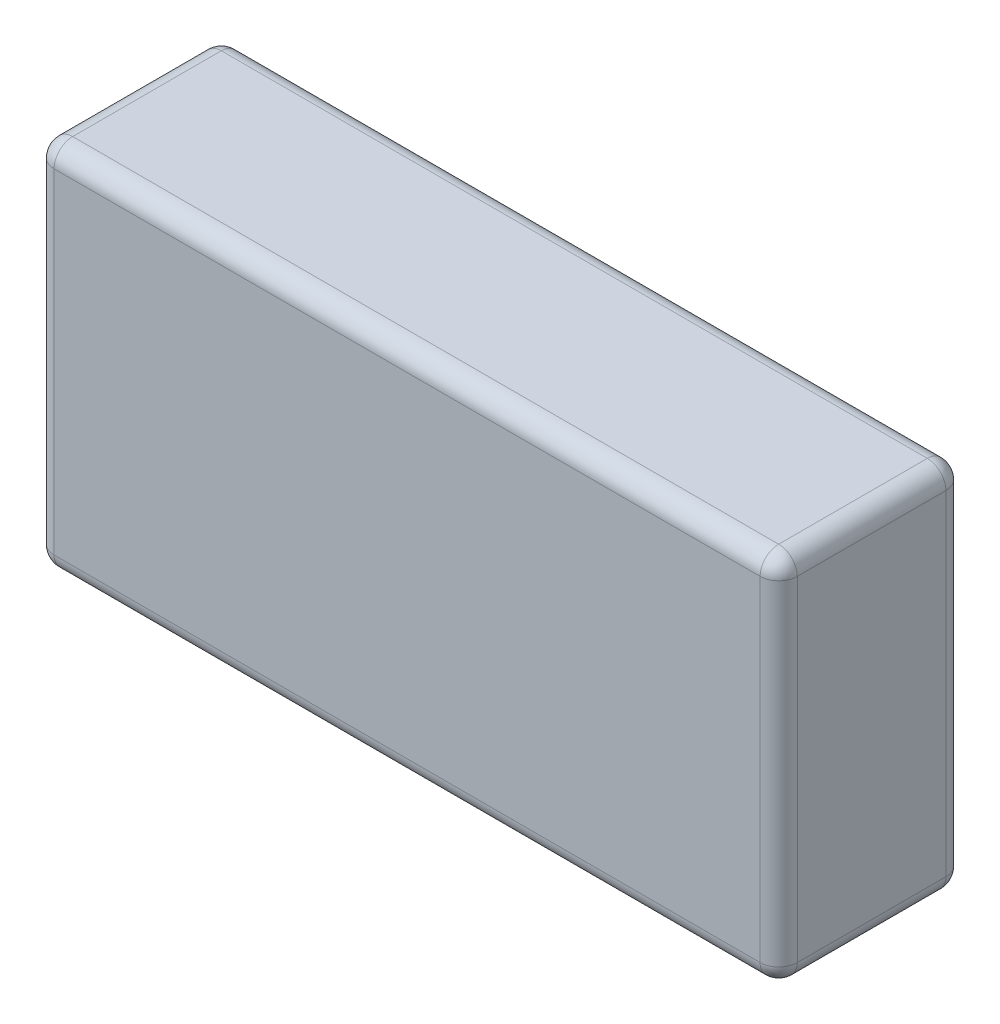
ISO-10303-21;
HEADER;
FILE_DESCRIPTION(('STEP AP214'),'2;1');
FILE_NAME('part.step','',(''),(''),'','','');
FILE_SCHEMA(('AUTOMOTIVE_DESIGN { 1 0 10303 214 1 1 1 1 }'));
ENDSEC;
DATA;
#1=APPLICATION_CONTEXT('core data for automotive mechanical design processes');
#2=APPLICATION_PROTOCOL_DEFINITION('international standard','automotive_design',2000,#1);
#3=PRODUCT_CONTEXT('',#1,'mechanical');
#4=PRODUCT('Part','Part','',(#3));
#5=PRODUCT_RELATED_PRODUCT_CATEGORY('part','',(#4));
#6=PRODUCT_DEFINITION_FORMATION('','',#4);
#7=PRODUCT_DEFINITION_CONTEXT('part definition',#1,'design');
#8=PRODUCT_DEFINITION('design','',#6,#7);
#9=PRODUCT_DEFINITION_SHAPE('','',#8);
#10=(LENGTH_UNIT() NAMED_UNIT(*) SI_UNIT(.MILLI.,.METRE.));
#11=(NAMED_UNIT(*) PLANE_ANGLE_UNIT() SI_UNIT($,.RADIAN.));
#12=(NAMED_UNIT(*) SI_UNIT($,.STERADIAN.) SOLID_ANGLE_UNIT());
#13=UNCERTAINTY_MEASURE_WITH_UNIT(LENGTH_MEASURE(1.E-05),#10,'distance_accuracy_value','');
#14=(GEOMETRIC_REPRESENTATION_CONTEXT(3) GLOBAL_UNCERTAINTY_ASSIGNED_CONTEXT((#13)) GLOBAL_UNIT_ASSIGNED_CONTEXT((#10,
#11,#12)) REPRESENTATION_CONTEXT('',''));
#15=CARTESIAN_POINT('',(0.,0.,0.));
#16=DIRECTION('',(0.,0.,1.));
#17=DIRECTION('',(1.,0.,0.));
#18=AXIS2_PLACEMENT_3D('',#15,#16,#17);
#19=CARTESIAN_POINT('',(-54.0520418666152,100.,-23.4294738015234));
#20=DIRECTION('',(1.,0.,0.));
#21=DIRECTION('',(0.,0.,-1.));
#22=AXIS2_PLACEMENT_3D('',#19,#20,#21);
#23=PLANE('',#22);
#24=DIRECTION('',(0.,0.,1.));
#25=VECTOR('',#24,1.);
#26=CARTESIAN_POINT('',(-54.0520418666152,5.,-23.4294738015234));
#27=LINE('',#26,#25);
#28=CARTESIAN_POINT('',(-54.0520418666152,5.,-18.4294738015234));
#29=VERTEX_POINT('',#28);
#30=CARTESIAN_POINT('',(-54.0520418666152,5.,21.5705261984766));
#31=VERTEX_POINT('',#30);
#32=EDGE_CURVE('E180',#29,#31,#27,.T.);
#33=ORIENTED_EDGE('',*,*,#32,.T.);
#34=DIRECTION('',(0.,-1.,0.));
#35=VECTOR('',#34,1.);
#36=CARTESIAN_POINT('',(-54.0520418666152,100.,21.5705261984766));
#37=LINE('',#36,#35);
#38=CARTESIAN_POINT('',(-54.0520418666152,95.,21.5705261984766));
#39=VERTEX_POINT('',#38);
#40=EDGE_CURVE('E187',#31,#39,#37,.F.);
#41=ORIENTED_EDGE('',*,*,#40,.T.);
#42=DIRECTION('',(0.,0.,1.));
#43=VECTOR('',#42,1.);
#44=CARTESIAN_POINT('',(-54.0520418666152,95.,-23.4294738015234));
#45=LINE('',#44,#43);
#46=CARTESIAN_POINT('',(-54.0520418666152,95.,-18.4294738015234));
#47=VERTEX_POINT('',#46);
#48=EDGE_CURVE('E183',#39,#47,#45,.F.);
#49=ORIENTED_EDGE('',*,*,#48,.T.);
#50=DIRECTION('',(0.,-1.,0.));
#51=VECTOR('',#50,1.);
#52=CARTESIAN_POINT('',(-54.0520418666152,100.,-18.4294738015234));
#53=LINE('',#52,#51);
#54=EDGE_CURVE('E177',#47,#29,#53,.T.);
#55=ORIENTED_EDGE('',*,*,#54,.T.);
#56=EDGE_LOOP('',(#33,#41,#49,#55));
#57=FACE_BOUND('',#56,.T.);
#58=ADVANCED_FACE('F39',(#57),#23,.F.);
#59=CARTESIAN_POINT('',(-54.0520418666152,100.,26.5705261984766));
#60=DIRECTION('',(0.,0.,-1.));
#61=DIRECTION('',(-1.,0.,0.));
#62=AXIS2_PLACEMENT_3D('',#59,#60,#61);
#63=PLANE('',#62);
#64=DIRECTION('',(1.,0.,0.));
#65=VECTOR('',#64,1.);
#66=CARTESIAN_POINT('',(-54.0520418666152,95.,26.5705261984766));
#67=LINE('',#66,#65);
#68=CARTESIAN_POINT('',(140.947958133385,95.,26.5705261984766));
#69=VERTEX_POINT('',#68);
#70=CARTESIAN_POINT('',(-49.0520418666152,95.,26.5705261984766));
#71=VERTEX_POINT('',#70);
#72=EDGE_CURVE('E209',#69,#71,#67,.F.);
#73=ORIENTED_EDGE('',*,*,#72,.T.);
#74=DIRECTION('',(0.,-1.,0.));
#75=VECTOR('',#74,1.);
#76=CARTESIAN_POINT('',(-49.0520418666152,100.,26.5705261984766));
#77=LINE('',#76,#75);
#78=CARTESIAN_POINT('',(-49.0520418666152,5.,26.5705261984766));
#79=VERTEX_POINT('',#78);
#80=EDGE_CURVE('E212',#71,#79,#77,.T.);
#81=ORIENTED_EDGE('',*,*,#80,.T.);
#82=DIRECTION('',(1.,0.,0.));
#83=VECTOR('',#82,1.);
#84=CARTESIAN_POINT('',(-54.0520418666152,5.,26.5705261984766));
#85=LINE('',#84,#83);
#86=CARTESIAN_POINT('',(140.947958133385,5.,26.5705261984766));
#87=VERTEX_POINT('',#86);
#88=EDGE_CURVE('E206',#79,#87,#85,.T.);
#89=ORIENTED_EDGE('',*,*,#88,.T.);
#90=DIRECTION('',(0.,-1.,0.));
#91=VECTOR('',#90,1.);
#92=CARTESIAN_POINT('',(140.947958133385,100.,26.5705261984766));
#93=LINE('',#92,#91);
#94=EDGE_CURVE('E203',#87,#69,#93,.F.);
#95=ORIENTED_EDGE('',*,*,#94,.T.);
#96=EDGE_LOOP('',(#73,#81,#89,#95));
#97=FACE_BOUND('',#96,.T.);
#98=ADVANCED_FACE('F330',(#97),#63,.F.);
#99=CARTESIAN_POINT('',(145.947958133385,100.,-23.4294738015234));
#100=DIRECTION('',(-1.,0.,0.));
#101=DIRECTION('',(0.,0.,1.));
#102=AXIS2_PLACEMENT_3D('',#99,#100,#101);
#103=PLANE('',#102);
#104=DIRECTION('',(0.,0.,-1.));
#105=VECTOR('',#104,1.);
#106=CARTESIAN_POINT('',(145.947958133385,95.,26.5705261984766));
#107=LINE('',#106,#105);
#108=CARTESIAN_POINT('',(145.947958133385,95.,-18.4294738015234));
#109=VERTEX_POINT('',#108);
#110=CARTESIAN_POINT('',(145.947958133385,95.,21.5705261984766));
#111=VERTEX_POINT('',#110);
#112=EDGE_CURVE('E146',#109,#111,#107,.F.);
#113=ORIENTED_EDGE('',*,*,#112,.T.);
#114=DIRECTION('',(0.,-1.,0.));
#115=VECTOR('',#114,1.);
#116=CARTESIAN_POINT('',(145.947958133385,100.,21.5705261984766));
#117=LINE('',#116,#115);
#118=CARTESIAN_POINT('',(145.947958133385,5.,21.5705261984766));
#119=VERTEX_POINT('',#118);
#120=EDGE_CURVE('E224',#111,#119,#117,.T.);
#121=ORIENTED_EDGE('',*,*,#120,.T.);
#122=DIRECTION('',(0.,0.,-1.));
#123=VECTOR('',#122,1.);
#124=CARTESIAN_POINT('',(145.947958133385,5.,-23.4294738015234));
#125=LINE('',#124,#123);
#126=CARTESIAN_POINT('',(145.947958133385,5.,-18.4294738015234));
#127=VERTEX_POINT('',#126);
#128=EDGE_CURVE('E219',#119,#127,#125,.T.);
#129=ORIENTED_EDGE('',*,*,#128,.T.);
#130=DIRECTION('',(0.,-1.,0.));
#131=VECTOR('',#130,1.);
#132=CARTESIAN_POINT('',(145.947958133385,100.,-18.4294738015234));
#133=LINE('',#132,#131);
#134=EDGE_CURVE('E216',#127,#109,#133,.F.);
#135=ORIENTED_EDGE('',*,*,#134,.T.);
#136=EDGE_LOOP('',(#113,#121,#129,#135));
#137=FACE_BOUND('',#136,.T.);
#138=ADVANCED_FACE('F317',(#137),#103,.F.);
#139=CARTESIAN_POINT('',(-54.0520418666152,100.,-23.4294738015234));
#140=DIRECTION('',(0.,0.,1.));
#141=DIRECTION('',(1.,0.,0.));
#142=AXIS2_PLACEMENT_3D('',#139,#140,#141);
#143=PLANE('',#142);
#144=DIRECTION('',(-1.,0.,0.));
#145=VECTOR('',#144,1.);
#146=CARTESIAN_POINT('',(145.947958133385,95.,-23.4294738015234));
#147=LINE('',#146,#145);
#148=CARTESIAN_POINT('',(-49.0520418666152,95.,-23.4294738015234));
#149=VERTEX_POINT('',#148);
#150=CARTESIAN_POINT('',(140.947958133385,95.,-23.4294738015234));
#151=VERTEX_POINT('',#150);
#152=EDGE_CURVE('E49',#149,#151,#147,.F.);
#153=ORIENTED_EDGE('',*,*,#152,.T.);
#154=DIRECTION('',(0.,-1.,0.));
#155=VECTOR('',#154,1.);
#156=CARTESIAN_POINT('',(140.947958133385,100.,-23.4294738015234));
#157=LINE('',#156,#155);
#158=CARTESIAN_POINT('',(140.947958133385,5.,-23.4294738015234));
#159=VERTEX_POINT('',#158);
#160=EDGE_CURVE('E11',#151,#159,#157,.T.);
#161=ORIENTED_EDGE('',*,*,#160,.T.);
#162=DIRECTION('',(-1.,0.,0.));
#163=VECTOR('',#162,1.);
#164=CARTESIAN_POINT('',(-54.0520418666152,5.,-23.4294738015234));
#165=LINE('',#164,#163);
#166=CARTESIAN_POINT('',(-49.0520418666152,5.,-23.4294738015234));
#167=VERTEX_POINT('',#166);
#168=EDGE_CURVE('E228',#159,#167,#165,.T.);
#169=ORIENTED_EDGE('',*,*,#168,.T.);
#170=DIRECTION('',(0.,-1.,0.));
#171=VECTOR('',#170,1.);
#172=CARTESIAN_POINT('',(-49.0520418666152,100.,-23.4294738015234));
#173=LINE('',#172,#171);
#174=EDGE_CURVE('E60',#167,#149,#173,.F.);
#175=ORIENTED_EDGE('',*,*,#174,.T.);
#176=EDGE_LOOP('',(#153,#161,#169,#175));
#177=FACE_BOUND('',#176,.T.);
#178=ADVANCED_FACE('F363',(#177),#143,.F.);
#179=CARTESIAN_POINT('',(0.,100.,0.));
#180=DIRECTION('',(0.,1.,0.));
#181=DIRECTION('',(0.,0.,1.));
#182=AXIS2_PLACEMENT_3D('',#179,#180,#181);
#183=PLANE('',#182);
#184=DIRECTION('',(-1.,0.,0.));
#185=VECTOR('',#184,1.);
#186=CARTESIAN_POINT('',(-54.0520418666152,100.,-18.4294738015234));
#187=LINE('',#186,#185);
#188=CARTESIAN_POINT('',(140.947958133385,100.,-18.4294738015234));
#189=VERTEX_POINT('',#188);
#190=CARTESIAN_POINT('',(-49.0520418666152,100.,-18.4294738015234));
#191=VERTEX_POINT('',#190);
#192=EDGE_CURVE('E132',#189,#191,#187,.T.);
#193=ORIENTED_EDGE('',*,*,#192,.T.);
#194=DIRECTION('',(0.,0.,1.));
#195=VECTOR('',#194,1.);
#196=CARTESIAN_POINT('',(-49.0520418666152,100.,26.5705261984766));
#197=LINE('',#196,#195);
#198=CARTESIAN_POINT('',(-49.0520418666152,100.,21.5705261984766));
#199=VERTEX_POINT('',#198);
#200=EDGE_CURVE('E174',#191,#199,#197,.T.);
#201=ORIENTED_EDGE('',*,*,#200,.T.);
#202=DIRECTION('',(1.,0.,0.));
#203=VECTOR('',#202,1.);
#204=CARTESIAN_POINT('',(145.947958133385,100.,21.5705261984766));
#205=LINE('',#204,#203);
#206=CARTESIAN_POINT('',(140.947958133385,100.,21.5705261984766));
#207=VERTEX_POINT('',#206);
#208=EDGE_CURVE('E135',#199,#207,#205,.T.);
#209=ORIENTED_EDGE('',*,*,#208,.T.);
#210=DIRECTION('',(0.,0.,-1.));
#211=VECTOR('',#210,1.);
#212=CARTESIAN_POINT('',(140.947958133385,100.,-23.4294738015234));
#213=LINE('',#212,#211);
#214=EDGE_CURVE('E127',#207,#189,#213,.T.);
#215=ORIENTED_EDGE('',*,*,#214,.T.);
#216=EDGE_LOOP('',(#193,#201,#209,#215));
#217=FACE_BOUND('',#216,.T.);
#218=ADVANCED_FACE('F129',(#217),#183,.T.);
#219=CARTESIAN_POINT('',(0.,0.,0.));
#220=DIRECTION('',(0.,1.,0.));
#221=DIRECTION('',(0.,0.,1.));
#222=AXIS2_PLACEMENT_3D('',#219,#220,#221);
#223=PLANE('',#222);
#224=DIRECTION('',(1.,0.,0.));
#225=VECTOR('',#224,1.);
#226=CARTESIAN_POINT('',(0.,0.,21.5705261984766));
#227=LINE('',#226,#225);
#228=CARTESIAN_POINT('',(140.947958133385,0.,21.5705261984766));
#229=VERTEX_POINT('',#228);
#230=CARTESIAN_POINT('',(-49.0520418666152,0.,21.5705261984766));
#231=VERTEX_POINT('',#230);
#232=EDGE_CURVE('E196',#229,#231,#227,.F.);
#233=ORIENTED_EDGE('',*,*,#232,.T.);
#234=DIRECTION('',(0.,0.,1.));
#235=VECTOR('',#234,1.);
#236=CARTESIAN_POINT('',(-49.0520418666152,0.,0.));
#237=LINE('',#236,#235);
#238=CARTESIAN_POINT('',(-49.0520418666152,0.,-18.4294738015234));
#239=VERTEX_POINT('',#238);
#240=EDGE_CURVE('E199',#231,#239,#237,.F.);
#241=ORIENTED_EDGE('',*,*,#240,.T.);
#242=DIRECTION('',(-1.,0.,0.));
#243=VECTOR('',#242,1.);
#244=CARTESIAN_POINT('',(0.,0.,-18.4294738015234));
#245=LINE('',#244,#243);
#246=CARTESIAN_POINT('',(140.947958133385,0.,-18.4294738015234));
#247=VERTEX_POINT('',#246);
#248=EDGE_CURVE('E190',#239,#247,#245,.F.);
#249=ORIENTED_EDGE('',*,*,#248,.T.);
#250=DIRECTION('',(0.,0.,-1.));
#251=VECTOR('',#250,1.);
#252=CARTESIAN_POINT('',(140.947958133385,0.,0.));
#253=LINE('',#252,#251);
#254=EDGE_CURVE('E193',#247,#229,#253,.F.);
#255=ORIENTED_EDGE('',*,*,#254,.T.);
#256=EDGE_LOOP('',(#233,#241,#249,#255));
#257=FACE_BOUND('',#256,.T.);
#258=ADVANCED_FACE('F346',(#257),#223,.F.);
#259=CARTESIAN_POINT('',(140.947958133385,5.,-23.4294738015234));
#260=DIRECTION('',(0.,0.,-1.));
#261=DIRECTION('',(-1.,0.,0.));
#262=AXIS2_PLACEMENT_3D('',#259,#260,#261);
#263=CYLINDRICAL_SURFACE('',#262,5.);
#264=CARTESIAN_POINT('',(140.947958133385,5.,-18.4294738015234));
#265=DIRECTION('',(0.,0.,-1.));
#266=DIRECTION('',(-1.,0.,0.));
#267=AXIS2_PLACEMENT_3D('',#264,#265,#266);
#268=CIRCLE('',#267,5.);
#269=EDGE_CURVE('E43',#127,#247,#268,.T.);
#270=ORIENTED_EDGE('',*,*,#269,.F.);
#271=ORIENTED_EDGE('',*,*,#128,.F.);
#272=CARTESIAN_POINT('',(140.947958133385,5.,21.5705261984766));
#273=DIRECTION('',(0.,0.,1.));
#274=DIRECTION('',(1.,0.,0.));
#275=AXIS2_PLACEMENT_3D('',#272,#273,#274);
#276=CIRCLE('',#275,5.);
#277=EDGE_CURVE('E170',#229,#119,#276,.T.);
#278=ORIENTED_EDGE('',*,*,#277,.F.);
#279=ORIENTED_EDGE('',*,*,#254,.F.);
#280=EDGE_LOOP('',(#270,#271,#278,#279));
#281=FACE_BOUND('',#280,.T.);
#282=ADVANCED_FACE('F41',(#281),#263,.T.);
#283=CARTESIAN_POINT('',(140.947958133385,5.,-18.4294738015234));
#284=DIRECTION('',(0.,0.,1.));
#285=DIRECTION('',(1.,0.,0.));
#286=AXIS2_PLACEMENT_3D('',#283,#284,#285);
#287=SPHERICAL_SURFACE('',#286,5.);
#288=CARTESIAN_POINT('',(140.947958133385,5.,-18.4294738015234));
#289=DIRECTION('',(0.,-1.,0.));
#290=DIRECTION('',(0.,0.,-1.));
#291=AXIS2_PLACEMENT_3D('',#288,#289,#290);
#292=CIRCLE('',#291,5.);
#293=EDGE_CURVE('E294',#127,#159,#292,.F.);
#294=ORIENTED_EDGE('',*,*,#293,.F.);
#295=ORIENTED_EDGE('',*,*,#269,.T.);
#296=CARTESIAN_POINT('',(140.947958133385,5.,-18.4294738015234));
#297=DIRECTION('',(1.,0.,0.));
#298=DIRECTION('',(0.,0.,-1.));
#299=AXIS2_PLACEMENT_3D('',#296,#297,#298);
#300=CIRCLE('',#299,5.);
#301=EDGE_CURVE('E298',#159,#247,#300,.F.);
#302=ORIENTED_EDGE('',*,*,#301,.F.);
#303=EDGE_LOOP('',(#294,#295,#302));
#304=FACE_BOUND('',#303,.T.);
#305=ADVANCED_FACE('F359',(#304),#287,.T.);
#306=CARTESIAN_POINT('',(140.947958133385,5.,21.5705261984766));
#307=DIRECTION('',(0.,0.,1.));
#308=DIRECTION('',(1.,0.,0.));
#309=AXIS2_PLACEMENT_3D('',#306,#307,#308);
#310=SPHERICAL_SURFACE('',#309,5.);
#311=CARTESIAN_POINT('',(140.947958133385,5.,21.5705261984766));
#312=DIRECTION('',(1.,0.,0.));
#313=DIRECTION('',(0.,0.,-1.));
#314=AXIS2_PLACEMENT_3D('',#311,#312,#313);
#315=CIRCLE('',#314,5.);
#316=EDGE_CURVE('E287',#229,#87,#315,.F.);
#317=ORIENTED_EDGE('',*,*,#316,.F.);
#318=ORIENTED_EDGE('',*,*,#277,.T.);
#319=CARTESIAN_POINT('',(140.947958133385,5.,21.5705261984766));
#320=DIRECTION('',(0.,-1.,0.));
#321=DIRECTION('',(0.,0.,-1.));
#322=AXIS2_PLACEMENT_3D('',#319,#320,#321);
#323=CIRCLE('',#322,5.);
#324=EDGE_CURVE('E291',#87,#119,#323,.F.);
#325=ORIENTED_EDGE('',*,*,#324,.F.);
#326=EDGE_LOOP('',(#317,#318,#325));
#327=FACE_BOUND('',#326,.T.);
#328=ADVANCED_FACE('F308',(#327),#310,.T.);
#329=CARTESIAN_POINT('',(-54.0520418666152,5.,-18.4294738015234));
#330=DIRECTION('',(-1.,0.,0.));
#331=DIRECTION('',(0.,0.,1.));
#332=AXIS2_PLACEMENT_3D('',#329,#330,#331);
#333=CYLINDRICAL_SURFACE('',#332,5.);
#334=ORIENTED_EDGE('',*,*,#301,.T.);
#335=ORIENTED_EDGE('',*,*,#248,.F.);
#336=CARTESIAN_POINT('',(-49.0520418666152,5.,-18.4294738015234));
#337=DIRECTION('',(-1.,0.,0.));
#338=DIRECTION('',(0.,0.,1.));
#339=AXIS2_PLACEMENT_3D('',#336,#337,#338);
#340=CIRCLE('',#339,5.);
#341=EDGE_CURVE('E280',#167,#239,#340,.T.);
#342=ORIENTED_EDGE('',*,*,#341,.F.);
#343=ORIENTED_EDGE('',*,*,#168,.F.);
#344=EDGE_LOOP('',(#334,#335,#342,#343));
#345=FACE_BOUND('',#344,.T.);
#346=ADVANCED_FACE('F356',(#345),#333,.T.);
#347=CARTESIAN_POINT('',(140.947958133385,100.,-18.4294738015234));
#348=DIRECTION('',(0.,-1.,0.));
#349=DIRECTION('',(0.,0.,-1.));
#350=AXIS2_PLACEMENT_3D('',#347,#348,#349);
#351=CYLINDRICAL_SURFACE('',#350,5.);
#352=ORIENTED_EDGE('',*,*,#293,.T.);
#353=ORIENTED_EDGE('',*,*,#160,.F.);
#354=CARTESIAN_POINT('',(140.947958133385,95.,-18.4294738015234));
#355=DIRECTION('',(0.,1.,0.));
#356=DIRECTION('',(0.,0.,1.));
#357=AXIS2_PLACEMENT_3D('',#354,#355,#356);
#358=CIRCLE('',#357,5.);
#359=EDGE_CURVE('E151',#109,#151,#358,.T.);
#360=ORIENTED_EDGE('',*,*,#359,.F.);
#361=ORIENTED_EDGE('',*,*,#134,.F.);
#362=EDGE_LOOP('',(#352,#353,#360,#361));
#363=FACE_BOUND('',#362,.T.);
#364=ADVANCED_FACE('F362',(#363),#351,.T.);
#365=CARTESIAN_POINT('',(140.947958133385,95.,0.));
#366=DIRECTION('',(0.,0.,1.));
#367=DIRECTION('',(1.,0.,0.));
#368=AXIS2_PLACEMENT_3D('',#365,#366,#367);
#369=CYLINDRICAL_SURFACE('',#368,5.);
#370=CARTESIAN_POINT('',(140.947958133385,95.,21.5705261984766));
#371=DIRECTION('',(0.,0.,1.));
#372=DIRECTION('',(0.,-1.,0.));
#373=AXIS2_PLACEMENT_3D('',#370,#371,#372);
#374=CIRCLE('',#373,5.);
#375=EDGE_CURVE('E152',#111,#207,#374,.T.);
#376=ORIENTED_EDGE('',*,*,#375,.F.);
#377=ORIENTED_EDGE('',*,*,#112,.F.);
#378=CARTESIAN_POINT('',(140.947958133385,95.,-18.4294738015234));
#379=DIRECTION('',(0.,0.,-1.));
#380=DIRECTION('',(-1.,0.,0.));
#381=AXIS2_PLACEMENT_3D('',#378,#379,#380);
#382=CIRCLE('',#381,5.);
#383=EDGE_CURVE('E143',#189,#109,#382,.T.);
#384=ORIENTED_EDGE('',*,*,#383,.F.);
#385=ORIENTED_EDGE('',*,*,#214,.F.);
#386=EDGE_LOOP('',(#376,#377,#384,#385));
#387=FACE_BOUND('',#386,.T.);
#388=ADVANCED_FACE('F145',(#387),#369,.T.);
#389=CARTESIAN_POINT('',(140.947958133385,100.,21.5705261984766));
#390=DIRECTION('',(0.,-1.,0.));
#391=DIRECTION('',(0.,0.,-1.));
#392=AXIS2_PLACEMENT_3D('',#389,#390,#391);
#393=CYLINDRICAL_SURFACE('',#392,5.);
#394=ORIENTED_EDGE('',*,*,#324,.T.);
#395=ORIENTED_EDGE('',*,*,#120,.F.);
#396=CARTESIAN_POINT('',(140.947958133385,95.,21.5705261984766));
#397=DIRECTION('',(0.,1.,0.));
#398=DIRECTION('',(0.,0.,1.));
#399=AXIS2_PLACEMENT_3D('',#396,#397,#398);
#400=CIRCLE('',#399,5.);
#401=EDGE_CURVE('E272',#69,#111,#400,.T.);
#402=ORIENTED_EDGE('',*,*,#401,.F.);
#403=ORIENTED_EDGE('',*,*,#94,.F.);
#404=EDGE_LOOP('',(#394,#395,#402,#403));
#405=FACE_BOUND('',#404,.T.);
#406=ADVANCED_FACE('F320',(#405),#393,.T.);
#407=CARTESIAN_POINT('',(-54.0520418666152,5.,21.5705261984766));
#408=DIRECTION('',(1.,0.,0.));
#409=DIRECTION('',(0.,0.,-1.));
#410=AXIS2_PLACEMENT_3D('',#407,#408,#409);
#411=CYLINDRICAL_SURFACE('',#410,5.);
#412=ORIENTED_EDGE('',*,*,#316,.T.);
#413=ORIENTED_EDGE('',*,*,#88,.F.);
#414=CARTESIAN_POINT('',(-49.0520418666152,5.,21.5705261984766));
#415=DIRECTION('',(-1.,0.,0.));
#416=DIRECTION('',(0.,0.,1.));
#417=AXIS2_PLACEMENT_3D('',#414,#415,#416);
#418=CIRCLE('',#417,5.);
#419=EDGE_CURVE('E268',#231,#79,#418,.T.);
#420=ORIENTED_EDGE('',*,*,#419,.F.);
#421=ORIENTED_EDGE('',*,*,#232,.F.);
#422=EDGE_LOOP('',(#412,#413,#420,#421));
#423=FACE_BOUND('',#422,.T.);
#424=ADVANCED_FACE('F343',(#423),#411,.T.);
#425=CARTESIAN_POINT('',(-49.0520418666152,5.,-23.4294738015234));
#426=DIRECTION('',(0.,0.,1.));
#427=DIRECTION('',(1.,0.,0.));
#428=AXIS2_PLACEMENT_3D('',#425,#426,#427);
#429=CYLINDRICAL_SURFACE('',#428,5.);
#430=CARTESIAN_POINT('',(-49.0520418666152,5.,-18.4294738015234));
#431=DIRECTION('',(0.,0.,-1.));
#432=DIRECTION('',(-1.,0.,0.));
#433=AXIS2_PLACEMENT_3D('',#430,#431,#432);
#434=CIRCLE('',#433,5.);
#435=EDGE_CURVE('E283',#239,#29,#434,.T.);
#436=ORIENTED_EDGE('',*,*,#435,.F.);
#437=ORIENTED_EDGE('',*,*,#240,.F.);
#438=CARTESIAN_POINT('',(-49.0520418666152,5.,21.5705261984766));
#439=DIRECTION('',(0.,0.,1.));
#440=DIRECTION('',(1.,0.,0.));
#441=AXIS2_PLACEMENT_3D('',#438,#439,#440);
#442=CIRCLE('',#441,5.);
#443=EDGE_CURVE('E264',#31,#231,#442,.T.);
#444=ORIENTED_EDGE('',*,*,#443,.F.);
#445=ORIENTED_EDGE('',*,*,#32,.F.);
#446=EDGE_LOOP('',(#436,#437,#444,#445));
#447=FACE_BOUND('',#446,.T.);
#448=ADVANCED_FACE('F349',(#447),#429,.T.);
#449=CARTESIAN_POINT('',(-49.0520418666152,5.,-18.4294738015234));
#450=DIRECTION('',(0.,0.,1.));
#451=DIRECTION('',(1.,0.,0.));
#452=AXIS2_PLACEMENT_3D('',#449,#450,#451);
#453=SPHERICAL_SURFACE('',#452,5.);
#454=ORIENTED_EDGE('',*,*,#341,.T.);
#455=ORIENTED_EDGE('',*,*,#435,.T.);
#456=CARTESIAN_POINT('',(-49.0520418666152,5.,-18.4294738015234));
#457=DIRECTION('',(0.,-1.,0.));
#458=DIRECTION('',(0.,0.,-1.));
#459=AXIS2_PLACEMENT_3D('',#456,#457,#458);
#460=CIRCLE('',#459,5.);
#461=EDGE_CURVE('E159',#167,#29,#460,.F.);
#462=ORIENTED_EDGE('',*,*,#461,.F.);
#463=EDGE_LOOP('',(#454,#455,#462));
#464=FACE_BOUND('',#463,.T.);
#465=ADVANCED_FACE('F409',(#464),#453,.T.);
#466=CARTESIAN_POINT('',(140.947958133385,95.,-18.4294738015234));
#467=DIRECTION('',(0.,0.,1.));
#468=DIRECTION('',(1.,0.,0.));
#469=AXIS2_PLACEMENT_3D('',#466,#467,#468);
#470=SPHERICAL_SURFACE('',#469,5.);
#471=ORIENTED_EDGE('',*,*,#383,.T.);
#472=ORIENTED_EDGE('',*,*,#359,.T.);
#473=CARTESIAN_POINT('',(140.947958133385,95.,-18.4294738015234));
#474=DIRECTION('',(1.,0.,0.));
#475=DIRECTION('',(0.,0.,-1.));
#476=AXIS2_PLACEMENT_3D('',#473,#474,#475);
#477=CIRCLE('',#476,5.);
#478=EDGE_CURVE('E155',#189,#151,#477,.F.);
#479=ORIENTED_EDGE('',*,*,#478,.F.);
#480=EDGE_LOOP('',(#471,#472,#479));
#481=FACE_BOUND('',#480,.T.);
#482=ADVANCED_FACE('F156',(#481),#470,.T.);
#483=CARTESIAN_POINT('',(140.947958133385,95.,21.5705261984766));
#484=DIRECTION('',(0.,0.,1.));
#485=DIRECTION('',(1.,0.,0.));
#486=AXIS2_PLACEMENT_3D('',#483,#484,#485);
#487=SPHERICAL_SURFACE('',#486,5.);
#488=ORIENTED_EDGE('',*,*,#401,.T.);
#489=ORIENTED_EDGE('',*,*,#375,.T.);
#490=CARTESIAN_POINT('',(140.947958133385,95.,21.5705261984766));
#491=DIRECTION('',(1.,0.,0.));
#492=DIRECTION('',(0.,0.,-1.));
#493=AXIS2_PLACEMENT_3D('',#490,#491,#492);
#494=CIRCLE('',#493,5.);
#495=EDGE_CURVE('E160',#69,#207,#494,.F.);
#496=ORIENTED_EDGE('',*,*,#495,.F.);
#497=EDGE_LOOP('',(#488,#489,#496));
#498=FACE_BOUND('',#497,.T.);
#499=ADVANCED_FACE('F323',(#498),#487,.T.);
#500=CARTESIAN_POINT('',(-49.0520418666152,5.,21.5705261984766));
#501=DIRECTION('',(0.,0.,1.));
#502=DIRECTION('',(1.,0.,0.));
#503=AXIS2_PLACEMENT_3D('',#500,#501,#502);
#504=SPHERICAL_SURFACE('',#503,5.);
#505=ORIENTED_EDGE('',*,*,#443,.T.);
#506=ORIENTED_EDGE('',*,*,#419,.T.);
#507=CARTESIAN_POINT('',(-49.0520418666152,5.,21.5705261984766));
#508=DIRECTION('',(0.,-1.,0.));
#509=DIRECTION('',(0.,0.,-1.));
#510=AXIS2_PLACEMENT_3D('',#507,#508,#509);
#511=CIRCLE('',#510,5.);
#512=EDGE_CURVE('E255',#31,#79,#511,.F.);
#513=ORIENTED_EDGE('',*,*,#512,.F.);
#514=EDGE_LOOP('',(#505,#506,#513));
#515=FACE_BOUND('',#514,.T.);
#516=ADVANCED_FACE('F340',(#515),#504,.T.);
#517=CARTESIAN_POINT('',(-49.0520418666152,100.,-18.4294738015234));
#518=DIRECTION('',(0.,-1.,0.));
#519=DIRECTION('',(0.,0.,-1.));
#520=AXIS2_PLACEMENT_3D('',#517,#518,#519);
#521=CYLINDRICAL_SURFACE('',#520,5.);
#522=ORIENTED_EDGE('',*,*,#461,.T.);
#523=ORIENTED_EDGE('',*,*,#54,.F.);
#524=CARTESIAN_POINT('',(-49.0520418666152,95.,-18.4294738015234));
#525=DIRECTION('',(0.,1.,0.));
#526=DIRECTION('',(0.,0.,1.));
#527=AXIS2_PLACEMENT_3D('',#524,#525,#526);
#528=CIRCLE('',#527,5.);
#529=EDGE_CURVE('E251',#149,#47,#528,.T.);
#530=ORIENTED_EDGE('',*,*,#529,.F.);
#531=ORIENTED_EDGE('',*,*,#174,.F.);
#532=EDGE_LOOP('',(#522,#523,#530,#531));
#533=FACE_BOUND('',#532,.T.);
#534=ADVANCED_FACE('F399',(#533),#521,.T.);
#535=CARTESIAN_POINT('',(0.,95.,-18.4294738015234));
#536=DIRECTION('',(1.,0.,0.));
#537=DIRECTION('',(0.,0.,-1.));
#538=AXIS2_PLACEMENT_3D('',#535,#536,#537);
#539=CYLINDRICAL_SURFACE('',#538,5.);
#540=ORIENTED_EDGE('',*,*,#478,.T.);
#541=ORIENTED_EDGE('',*,*,#152,.F.);
#542=CARTESIAN_POINT('',(-49.0520418666152,95.,-18.4294738015234));
#543=DIRECTION('',(-1.,0.,0.));
#544=DIRECTION('',(0.,0.,1.));
#545=AXIS2_PLACEMENT_3D('',#542,#543,#544);
#546=CIRCLE('',#545,5.);
#547=EDGE_CURVE('E164',#191,#149,#546,.T.);
#548=ORIENTED_EDGE('',*,*,#547,.F.);
#549=ORIENTED_EDGE('',*,*,#192,.F.);
#550=EDGE_LOOP('',(#540,#541,#548,#549));
#551=FACE_BOUND('',#550,.T.);
#552=ADVANCED_FACE('F162',(#551),#539,.T.);
#553=CARTESIAN_POINT('',(0.,95.,21.5705261984766));
#554=DIRECTION('',(-1.,0.,0.));
#555=DIRECTION('',(0.,0.,1.));
#556=AXIS2_PLACEMENT_3D('',#553,#554,#555);
#557=CYLINDRICAL_SURFACE('',#556,5.);
#558=ORIENTED_EDGE('',*,*,#495,.T.);
#559=ORIENTED_EDGE('',*,*,#208,.F.);
#560=CARTESIAN_POINT('',(-49.0520418666152,95.,21.5705261984766));
#561=DIRECTION('',(-1.,0.,0.));
#562=DIRECTION('',(0.,0.,1.));
#563=AXIS2_PLACEMENT_3D('',#560,#561,#562);
#564=CIRCLE('',#563,5.);
#565=EDGE_CURVE('E245',#71,#199,#564,.T.);
#566=ORIENTED_EDGE('',*,*,#565,.F.);
#567=ORIENTED_EDGE('',*,*,#72,.F.);
#568=EDGE_LOOP('',(#558,#559,#566,#567));
#569=FACE_BOUND('',#568,.T.);
#570=ADVANCED_FACE('F327',(#569),#557,.T.);
#571=CARTESIAN_POINT('',(-49.0520418666152,100.,21.5705261984766));
#572=DIRECTION('',(0.,-1.,0.));
#573=DIRECTION('',(0.,0.,-1.));
#574=AXIS2_PLACEMENT_3D('',#571,#572,#573);
#575=CYLINDRICAL_SURFACE('',#574,5.);
#576=ORIENTED_EDGE('',*,*,#512,.T.);
#577=ORIENTED_EDGE('',*,*,#80,.F.);
#578=CARTESIAN_POINT('',(-49.0520418666152,95.,21.5705261984766));
#579=DIRECTION('',(0.,1.,0.));
#580=DIRECTION('',(0.,0.,1.));
#581=AXIS2_PLACEMENT_3D('',#578,#579,#580);
#582=CIRCLE('',#581,5.);
#583=EDGE_CURVE('E241',#39,#71,#582,.T.);
#584=ORIENTED_EDGE('',*,*,#583,.F.);
#585=ORIENTED_EDGE('',*,*,#40,.F.);
#586=EDGE_LOOP('',(#576,#577,#584,#585));
#587=FACE_BOUND('',#586,.T.);
#588=ADVANCED_FACE('F333',(#587),#575,.T.);
#589=CARTESIAN_POINT('',(-49.0520418666152,95.,-18.4294738015234));
#590=DIRECTION('',(0.,0.,1.));
#591=DIRECTION('',(1.,0.,0.));
#592=AXIS2_PLACEMENT_3D('',#589,#590,#591);
#593=SPHERICAL_SURFACE('',#592,5.);
#594=ORIENTED_EDGE('',*,*,#547,.T.);
#595=ORIENTED_EDGE('',*,*,#529,.T.);
#596=CARTESIAN_POINT('',(-49.0520418666152,95.,-18.4294738015234));
#597=DIRECTION('',(0.,0.,-1.));
#598=DIRECTION('',(-1.,0.,0.));
#599=AXIS2_PLACEMENT_3D('',#596,#597,#598);
#600=CIRCLE('',#599,5.);
#601=EDGE_CURVE('E238',#191,#47,#600,.F.);
#602=ORIENTED_EDGE('',*,*,#601,.F.);
#603=EDGE_LOOP('',(#594,#595,#602));
#604=FACE_BOUND('',#603,.T.);
#605=ADVANCED_FACE('F388',(#604),#593,.T.);
#606=CARTESIAN_POINT('',(-49.0520418666152,95.,21.5705261984766));
#607=DIRECTION('',(0.,0.,1.));
#608=DIRECTION('',(1.,0.,0.));
#609=AXIS2_PLACEMENT_3D('',#606,#607,#608);
#610=SPHERICAL_SURFACE('',#609,5.);
#611=ORIENTED_EDGE('',*,*,#583,.T.);
#612=ORIENTED_EDGE('',*,*,#565,.T.);
#613=CARTESIAN_POINT('',(-49.0520418666152,95.,21.5705261984766));
#614=DIRECTION('',(0.,0.,1.));
#615=DIRECTION('',(1.,0.,0.));
#616=AXIS2_PLACEMENT_3D('',#613,#614,#615);
#617=CIRCLE('',#616,5.);
#618=EDGE_CURVE('E235',#39,#199,#617,.F.);
#619=ORIENTED_EDGE('',*,*,#618,.F.);
#620=EDGE_LOOP('',(#611,#612,#619));
#621=FACE_BOUND('',#620,.T.);
#622=ADVANCED_FACE('F384',(#621),#610,.T.);
#623=CARTESIAN_POINT('',(-49.0520418666152,95.,0.));
#624=DIRECTION('',(0.,0.,-1.));
#625=DIRECTION('',(-1.,0.,0.));
#626=AXIS2_PLACEMENT_3D('',#623,#624,#625);
#627=CYLINDRICAL_SURFACE('',#626,5.);
#628=ORIENTED_EDGE('',*,*,#601,.T.);
#629=ORIENTED_EDGE('',*,*,#48,.F.);
#630=ORIENTED_EDGE('',*,*,#618,.T.);
#631=ORIENTED_EDGE('',*,*,#200,.F.);
#632=EDGE_LOOP('',(#628,#629,#630,#631));
#633=FACE_BOUND('',#632,.T.);
#634=ADVANCED_FACE('F381',(#633),#627,.T.);
#635=CLOSED_SHELL('',(#58,#98,#138,#178,#218,#258,#282,#305,#328,#346,#364,#388,#406,#424,#448,
#465,#482,#499,#516,#534,#552,#570,#588,#605,#622,#634));
#636=MANIFOLD_SOLID_BREP('B2',#635);
#637=ADVANCED_BREP_SHAPE_REPRESENTATION('',(#18,#636),#14);
#638=SHAPE_DEFINITION_REPRESENTATION(#9,#637);
ENDSEC;
END-ISO-10303-21;
